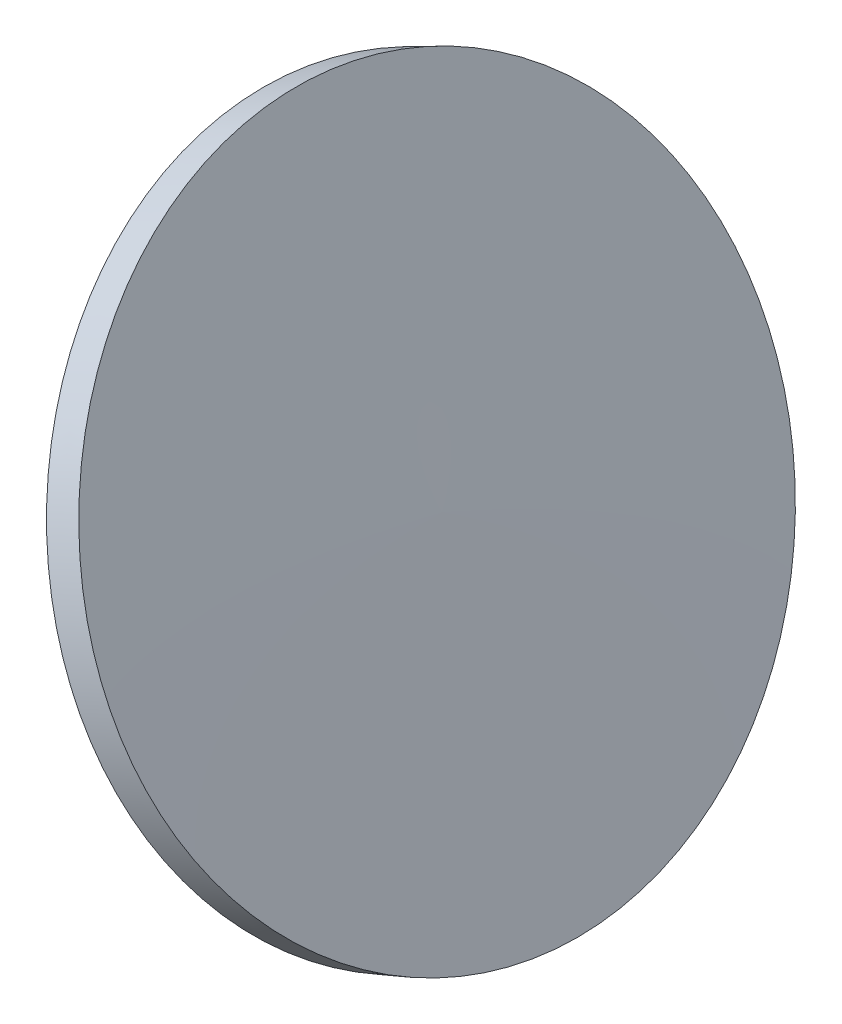
ISO-10303-21;
HEADER;
FILE_DESCRIPTION(('STEP AP214'),'2;1');
FILE_NAME('part.step','',(''),(''),'','','');
FILE_SCHEMA(('AUTOMOTIVE_DESIGN { 1 0 10303 214 1 1 1 1 }'));
ENDSEC;
DATA;
#1=APPLICATION_CONTEXT('core data for automotive mechanical design processes');
#2=APPLICATION_PROTOCOL_DEFINITION('international standard','automotive_design',2000,#1);
#3=PRODUCT_CONTEXT('',#1,'mechanical');
#4=PRODUCT('Part','Part','',(#3));
#5=PRODUCT_RELATED_PRODUCT_CATEGORY('part','',(#4));
#6=PRODUCT_DEFINITION_FORMATION('','',#4);
#7=PRODUCT_DEFINITION_CONTEXT('part definition',#1,'design');
#8=PRODUCT_DEFINITION('design','',#6,#7);
#9=PRODUCT_DEFINITION_SHAPE('','',#8);
#10=(LENGTH_UNIT() NAMED_UNIT(*) SI_UNIT(.MILLI.,.METRE.));
#11=(NAMED_UNIT(*) PLANE_ANGLE_UNIT() SI_UNIT($,.RADIAN.));
#12=(NAMED_UNIT(*) SI_UNIT($,.STERADIAN.) SOLID_ANGLE_UNIT());
#13=UNCERTAINTY_MEASURE_WITH_UNIT(LENGTH_MEASURE(1.E-05),#10,'distance_accuracy_value','');
#14=(GEOMETRIC_REPRESENTATION_CONTEXT(3) GLOBAL_UNCERTAINTY_ASSIGNED_CONTEXT((#13)) GLOBAL_UNIT_ASSIGNED_CONTEXT((#10,
#11,#12)) REPRESENTATION_CONTEXT('',''));
#15=CARTESIAN_POINT('',(0.,0.,0.));
#16=DIRECTION('',(0.,0.,1.));
#17=DIRECTION('',(1.,0.,0.));
#18=AXIS2_PLACEMENT_3D('',#15,#16,#17);
#19=CARTESIAN_POINT('',(500.606366903906,383.013331744011,0.));
#20=DIRECTION('',(0.,0.,-1.));
#21=DIRECTION('',(0.426066575848504,-0.904691811029994,0.));
#22=AXIS2_PLACEMENT_3D('',#19,#20,#21);
#23=CIRCLE('',#22,406.551526452957);
#24=TRIMMED_CURVE('',#23,(PARAMETER_VALUE(-1.59295729368469)),
(PARAMETER_VALUE(1.59295729368469)),.T.,.PARAMETER.);
#25=CARTESIAN_POINT('',(496.768002362836,391.163553246691,0.));
#26=DIRECTION('',(-0.904691811029994,-0.426066575848504,0.));
#27=AXIS1_PLACEMENT('',#25,#26);
#28=SURFACE_OF_REVOLUTION('',#24,#27);
#29=CARTESIAN_POINT('',(128.984422790462,217.955076623802,0.));
#30=DIRECTION('',(-0.904691811029994,-0.426066575848504,0.));
#31=DIRECTION('',(0.426066575848504,-0.904691811029994,0.));
#32=AXIS2_PLACEMENT_3D('',#29,#30,#31);
#33=CIRCLE('',#32,4.74200211086214);
#34=CARTESIAN_POINT('',(131.004831392504,213.665026146218,0.));
#35=VERTEX_POINT('',#34);
#36=EDGE_CURVE('E13',#35,#35,#33,.T.);
#37=ORIENTED_EDGE('',*,*,#36,.F.);
#38=EDGE_LOOP('',(#37));
#39=FACE_BOUND('',#38,.T.);
#40=CARTESIAN_POINT('',(129.054477709651,217.988069140343,0.));
#41=VERTEX_POINT('',#40);
#42=VERTEX_LOOP('',#41);
#43=FACE_BOUND('',#42,.T.);
#44=ADVANCED_FACE('F44',(#39,#43),#28,.F.);
#45=CARTESIAN_POINT('',(128.984422790462,217.955076623802,0.));
#46=DIRECTION('',(0.904691811029994,0.426066575848504,0.));
#47=DIRECTION('',(-0.426066575848504,0.904691811029994,0.));
#48=AXIS2_PLACEMENT_3D('',#45,#46,#47);
#49=CONICAL_SURFACE('',#48,4.74200211086215,0.0349463632016096);
#50=CARTESIAN_POINT('',(128.499874868995,217.726877726435,0.));
#51=DIRECTION('',(-0.904691811029994,-0.426066575848504,0.));
#52=DIRECTION('',(0.426066575848504,-0.904691811029994,0.));
#53=AXIS2_PLACEMENT_3D('',#50,#51,#52);
#54=CIRCLE('',#53,4.72327740923059);
#55=CARTESIAN_POINT('',(130.512305501529,213.453767333081,0.));
#56=VERTEX_POINT('',#55);
#57=EDGE_CURVE('E50',#56,#56,#54,.T.);
#58=ORIENTED_EDGE('',*,*,#57,.F.);
#59=EDGE_LOOP('',(#58));
#60=FACE_BOUND('',#59,.T.);
#61=ORIENTED_EDGE('',*,*,#36,.T.);
#62=EDGE_LOOP('',(#61));
#63=FACE_BOUND('',#62,.T.);
#64=ADVANCED_FACE('F54',(#60,#63),#49,.T.);
#65=CARTESIAN_POINT('',(6.27340118796321,160.164054139002,0.));
#66=DIRECTION('',(-0.904691811029994,-0.426066575848504,0.));
#67=DIRECTION('',(-0.426066575848504,0.904691811029994,0.));
#68=AXIS2_PLACEMENT_3D('',#65,#66,#67);
#69=SPHERICAL_SURFACE('',#68,135.185424056525);
#70=ORIENTED_EDGE('',*,*,#57,.T.);
#71=EDGE_LOOP('',(#70));
#72=FACE_BOUND('',#71,.T.);
#73=ADVANCED_FACE('F59',(#72),#69,.F.);
#74=CLOSED_SHELL('',(#44,#64,#73));
#75=MANIFOLD_SOLID_BREP('B2',#74);
#76=ADVANCED_BREP_SHAPE_REPRESENTATION('',(#18,#75),#14);
#77=SHAPE_DEFINITION_REPRESENTATION(#9,#76);
ENDSEC;
END-ISO-10303-21;
